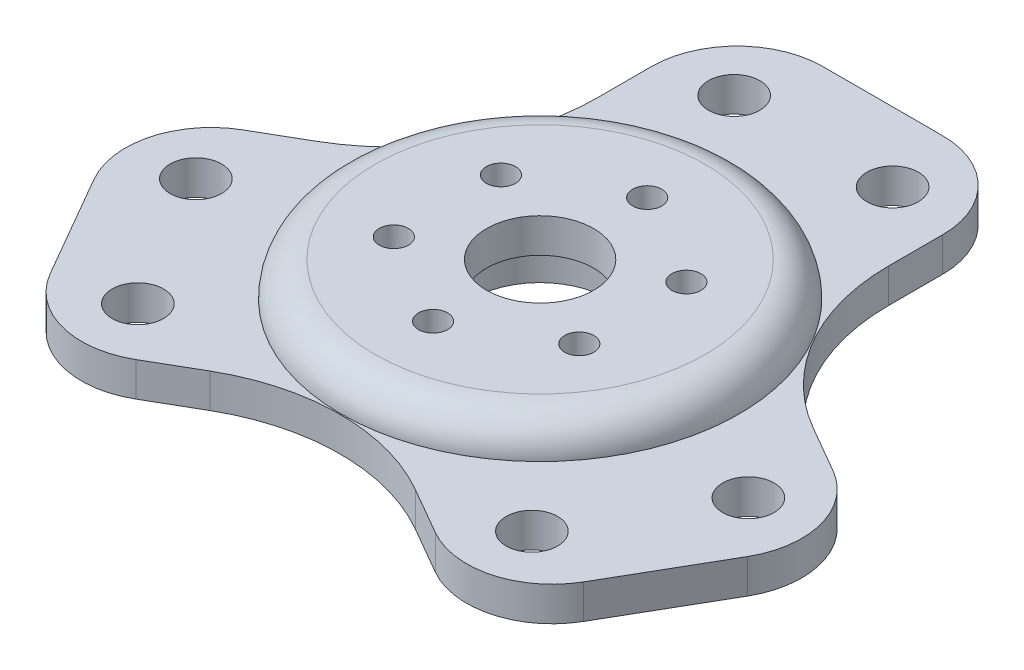
ISO-10303-21;
HEADER;
FILE_DESCRIPTION(('STEP AP214'),'2;1');
FILE_NAME('part.step','',(''),(''),'','','');
FILE_SCHEMA(('AUTOMOTIVE_DESIGN { 1 0 10303 214 1 1 1 1 }'));
ENDSEC;
DATA;
#1=APPLICATION_CONTEXT('core data for automotive mechanical design processes');
#2=APPLICATION_PROTOCOL_DEFINITION('international standard','automotive_design',2000,#1);
#3=PRODUCT_CONTEXT('',#1,'mechanical');
#4=PRODUCT('Part','Part','',(#3));
#5=PRODUCT_RELATED_PRODUCT_CATEGORY('part','',(#4));
#6=PRODUCT_DEFINITION_FORMATION('','',#4);
#7=PRODUCT_DEFINITION_CONTEXT('part definition',#1,'design');
#8=PRODUCT_DEFINITION('design','',#6,#7);
#9=PRODUCT_DEFINITION_SHAPE('','',#8);
#10=(LENGTH_UNIT() NAMED_UNIT(*) SI_UNIT(.MILLI.,.METRE.));
#11=(NAMED_UNIT(*) PLANE_ANGLE_UNIT() SI_UNIT($,.RADIAN.));
#12=(NAMED_UNIT(*) SI_UNIT($,.STERADIAN.) SOLID_ANGLE_UNIT());
#13=UNCERTAINTY_MEASURE_WITH_UNIT(LENGTH_MEASURE(1.E-05),#10,'distance_accuracy_value','');
#14=(GEOMETRIC_REPRESENTATION_CONTEXT(3) GLOBAL_UNCERTAINTY_ASSIGNED_CONTEXT((#13)) GLOBAL_UNIT_ASSIGNED_CONTEXT((#10,
#11,#12)) REPRESENTATION_CONTEXT('',''));
#15=CARTESIAN_POINT('',(0.,0.,0.));
#16=DIRECTION('',(0.,0.,1.));
#17=DIRECTION('',(1.,0.,0.));
#18=AXIS2_PLACEMENT_3D('',#15,#16,#17);
#19=CARTESIAN_POINT('',(0.,8.,0.));
#20=DIRECTION('',(0.,1.,0.));
#21=DIRECTION('',(0.,0.,1.));
#22=AXIS2_PLACEMENT_3D('',#19,#20,#21);
#23=PLANE('',#22);
#24=CARTESIAN_POINT('',(0.,8.,0.));
#25=DIRECTION('',(0.,1.,0.));
#26=DIRECTION('',(0.,0.,1.));
#27=AXIS2_PLACEMENT_3D('',#24,#25,#26);
#28=CIRCLE('',#27,19.25);
#29=CARTESIAN_POINT('',(0.,8.,19.25));
#30=VERTEX_POINT('',#29);
#31=EDGE_CURVE('E11',#30,#30,#28,.T.);
#32=ORIENTED_EDGE('',*,*,#31,.T.);
#33=EDGE_LOOP('',(#32));
#34=FACE_BOUND('',#33,.T.);
#35=CARTESIAN_POINT('',(0.,8.,0.));
#36=DIRECTION('',(0.,1.,0.));
#37=DIRECTION('',(0.,0.,1.));
#38=AXIS2_PLACEMENT_3D('',#35,#36,#37);
#39=CIRCLE('',#38,6.25);
#40=CARTESIAN_POINT('',(0.,8.,6.25));
#41=VERTEX_POINT('',#40);
#42=EDGE_CURVE('E226',#41,#41,#39,.T.);
#43=ORIENTED_EDGE('',*,*,#42,.F.);
#44=EDGE_LOOP('',(#43));
#45=FACE_BOUND('',#44,.T.);
#46=CARTESIAN_POINT('',(0.,8.,-12.5));
#47=DIRECTION('',(0.,1.,0.));
#48=DIRECTION('',(0.,0.,1.));
#49=AXIS2_PLACEMENT_3D('',#46,#47,#48);
#50=CIRCLE('',#49,1.7);
#51=CARTESIAN_POINT('',(0.,8.,-10.8));
#52=VERTEX_POINT('',#51);
#53=EDGE_CURVE('E256',#52,#52,#50,.T.);
#54=ORIENTED_EDGE('',*,*,#53,.F.);
#55=EDGE_LOOP('',(#54));
#56=FACE_BOUND('',#55,.T.);
#57=CARTESIAN_POINT('',(-10.8253175473055,8.,-6.24999999999998));
#58=DIRECTION('',(0.,1.,0.));
#59=DIRECTION('',(0.86602540378444,0.,0.499999999999998));
#60=AXIS2_PLACEMENT_3D('',#57,#58,#59);
#61=CIRCLE('',#60,1.7);
#62=CARTESIAN_POINT('',(-9.35307436087195,8.,-5.39999999999998));
#63=VERTEX_POINT('',#62);
#64=EDGE_CURVE('E262',#63,#63,#61,.T.);
#65=ORIENTED_EDGE('',*,*,#64,.F.);
#66=EDGE_LOOP('',(#65));
#67=FACE_BOUND('',#66,.T.);
#68=CARTESIAN_POINT('',(-10.8253175473055,8.,6.25000000000005));
#69=DIRECTION('',(0.,1.,0.));
#70=DIRECTION('',(0.866025403784436,0.,-0.500000000000004));
#71=AXIS2_PLACEMENT_3D('',#68,#69,#70);
#72=CIRCLE('',#71,1.7);
#73=CARTESIAN_POINT('',(-9.35307436087191,8.,5.40000000000004));
#74=VERTEX_POINT('',#73);
#75=EDGE_CURVE('E287',#74,#74,#72,.T.);
#76=ORIENTED_EDGE('',*,*,#75,.F.);
#77=EDGE_LOOP('',(#76));
#78=FACE_BOUND('',#77,.T.);
#79=CARTESIAN_POINT('',(0.,8.,12.5));
#80=DIRECTION('',(0.,1.,0.));
#81=DIRECTION('',(0.,0.,-1.));
#82=AXIS2_PLACEMENT_3D('',#79,#80,#81);
#83=CIRCLE('',#82,1.7);
#84=CARTESIAN_POINT('',(0.,8.,10.8));
#85=VERTEX_POINT('',#84);
#86=EDGE_CURVE('E281',#85,#85,#83,.T.);
#87=ORIENTED_EDGE('',*,*,#86,.F.);
#88=EDGE_LOOP('',(#87));
#89=FACE_BOUND('',#88,.T.);
#90=CARTESIAN_POINT('',(10.8253175473055,8.,6.2499999999999));
#91=DIRECTION('',(0.,1.,0.));
#92=DIRECTION('',(-0.866025403784443,0.,-0.499999999999992));
#93=AXIS2_PLACEMENT_3D('',#90,#91,#92);
#94=CIRCLE('',#93,1.7);
#95=CARTESIAN_POINT('',(9.35307436087199,8.,5.39999999999991));
#96=VERTEX_POINT('',#95);
#97=EDGE_CURVE('E275',#96,#96,#94,.T.);
#98=ORIENTED_EDGE('',*,*,#97,.F.);
#99=EDGE_LOOP('',(#98));
#100=FACE_BOUND('',#99,.T.);
#101=CARTESIAN_POINT('',(10.8253175473054,8.,-6.25000000000013));
#102=DIRECTION('',(0.,1.,0.));
#103=DIRECTION('',(-0.866025403784433,0.,0.50000000000001));
#104=AXIS2_PLACEMENT_3D('',#101,#102,#103);
#105=CIRCLE('',#104,1.7);
#106=CARTESIAN_POINT('',(9.35307436087188,8.,-5.40000000000011));
#107=VERTEX_POINT('',#106);
#108=EDGE_CURVE('E268',#107,#107,#105,.T.);
#109=ORIENTED_EDGE('',*,*,#108,.F.);
#110=EDGE_LOOP('',(#109));
#111=FACE_BOUND('',#110,.T.);
#112=ADVANCED_FACE('F37',(#34,#45,#56,#67,#78,#89,#100,#111),#23,.T.);
#113=CARTESIAN_POINT('',(0.,0.,0.));
#114=DIRECTION('',(0.,1.,0.));
#115=DIRECTION('',(0.,0.,1.));
#116=AXIS2_PLACEMENT_3D('',#113,#114,#115);
#117=PLANE('',#116);
#118=CARTESIAN_POINT('',(22.9998211249864,0.,23.9599328978324));
#119=DIRECTION('',(0.,1.,0.));
#120=DIRECTION('',(-0.866025403784436,0.,-0.500000000000004));
#121=AXIS2_PLACEMENT_3D('',#118,#119,#120);
#122=CIRCLE('',#121,3.);
#123=CARTESIAN_POINT('',(20.4017449136331,0.,22.4599328978324));
#124=VERTEX_POINT('',#123);
#125=EDGE_CURVE('E316',#124,#124,#122,.T.);
#126=ORIENTED_EDGE('',*,*,#125,.T.);
#127=EDGE_LOOP('',(#126));
#128=FACE_BOUND('',#127,.T.);
#129=CARTESIAN_POINT('',(-22.9998211249866,0.,23.9599328978322));
#130=DIRECTION('',(0.,1.,0.));
#131=DIRECTION('',(-0.866025403784436,0.,-0.500000000000004));
#132=AXIS2_PLACEMENT_3D('',#129,#130,#131);
#133=CIRCLE('',#132,3.);
#134=CARTESIAN_POINT('',(-25.5978973363399,0.,22.4599328978322));
#135=VERTEX_POINT('',#134);
#136=EDGE_CURVE('E339',#135,#135,#133,.T.);
#137=ORIENTED_EDGE('',*,*,#136,.T.);
#138=EDGE_LOOP('',(#137));
#139=FACE_BOUND('',#138,.T.);
#140=CARTESIAN_POINT('',(-32.2498211249866,0.,7.93846292781986));
#141=DIRECTION('',(0.,1.,0.));
#142=DIRECTION('',(0.866025403784443,0.,-0.499999999999992));
#143=AXIS2_PLACEMENT_3D('',#140,#141,#142);
#144=CIRCLE('',#143,3.);
#145=CARTESIAN_POINT('',(-29.6517449136332,0.,6.43846292781989));
#146=VERTEX_POINT('',#145);
#147=EDGE_CURVE('E333',#146,#146,#144,.T.);
#148=ORIENTED_EDGE('',*,*,#147,.T.);
#149=EDGE_LOOP('',(#148));
#150=FACE_BOUND('',#149,.T.);
#151=CARTESIAN_POINT('',(-9.2499999999997,0.,-31.8983958256525));
#152=DIRECTION('',(0.,1.,0.));
#153=DIRECTION('',(0.866025403784443,0.,-0.499999999999992));
#154=AXIS2_PLACEMENT_3D('',#151,#152,#153);
#155=CIRCLE('',#154,3.);
#156=CARTESIAN_POINT('',(-6.65192378864637,0.,-33.3983958256525));
#157=VERTEX_POINT('',#156);
#158=EDGE_CURVE('E327',#157,#157,#155,.T.);
#159=ORIENTED_EDGE('',*,*,#158,.T.);
#160=EDGE_LOOP('',(#159));
#161=FACE_BOUND('',#160,.T.);
#162=CARTESIAN_POINT('',(9.24999999999999,0.,-31.8983958256524));
#163=DIRECTION('',(0.,1.,0.));
#164=DIRECTION('',(0.,0.,1.));
#165=AXIS2_PLACEMENT_3D('',#162,#163,#164);
#166=CIRCLE('',#165,3.);
#167=CARTESIAN_POINT('',(9.24999999999999,0.,-28.8983958256524));
#168=VERTEX_POINT('',#167);
#169=EDGE_CURVE('E311',#168,#168,#166,.T.);
#170=ORIENTED_EDGE('',*,*,#169,.T.);
#171=EDGE_LOOP('',(#170));
#172=FACE_BOUND('',#171,.T.);
#173=CARTESIAN_POINT('',(32.2498211249865,0.,7.93846292782016));
#174=DIRECTION('',(0.,1.,0.));
#175=DIRECTION('',(0.,0.,1.));
#176=AXIS2_PLACEMENT_3D('',#173,#174,#175);
#177=CIRCLE('',#176,3.);
#178=CARTESIAN_POINT('',(32.2498211249865,0.,10.9384629278202));
#179=VERTEX_POINT('',#178);
#180=EDGE_CURVE('E315',#179,#179,#177,.T.);
#181=ORIENTED_EDGE('',*,*,#180,.T.);
#182=EDGE_LOOP('',(#181));
#183=FACE_BOUND('',#182,.T.);
#184=CARTESIAN_POINT('',(10.8253175473054,0.,-6.25000000000013));
#185=DIRECTION('',(0.,1.,0.));
#186=DIRECTION('',(-0.866025403784433,0.,0.50000000000001));
#187=AXIS2_PLACEMENT_3D('',#184,#185,#186);
#188=CIRCLE('',#187,1.7);
#189=CARTESIAN_POINT('',(9.35307436087188,0.,-5.40000000000011));
#190=VERTEX_POINT('',#189);
#191=EDGE_CURVE('E271',#190,#190,#188,.T.);
#192=ORIENTED_EDGE('',*,*,#191,.T.);
#193=EDGE_LOOP('',(#192));
#194=FACE_BOUND('',#193,.T.);
#195=CARTESIAN_POINT('',(10.8253175473055,0.,6.2499999999999));
#196=DIRECTION('',(0.,1.,0.));
#197=DIRECTION('',(-0.866025403784443,0.,-0.499999999999992));
#198=AXIS2_PLACEMENT_3D('',#195,#196,#197);
#199=CIRCLE('',#198,1.7);
#200=CARTESIAN_POINT('',(9.35307436087199,0.,5.39999999999991));
#201=VERTEX_POINT('',#200);
#202=EDGE_CURVE('E278',#201,#201,#199,.T.);
#203=ORIENTED_EDGE('',*,*,#202,.T.);
#204=EDGE_LOOP('',(#203));
#205=FACE_BOUND('',#204,.T.);
#206=CARTESIAN_POINT('',(0.,0.,12.5));
#207=DIRECTION('',(0.,1.,0.));
#208=DIRECTION('',(0.,0.,-1.));
#209=AXIS2_PLACEMENT_3D('',#206,#207,#208);
#210=CIRCLE('',#209,1.7);
#211=CARTESIAN_POINT('',(0.,0.,10.8));
#212=VERTEX_POINT('',#211);
#213=EDGE_CURVE('E284',#212,#212,#210,.T.);
#214=ORIENTED_EDGE('',*,*,#213,.T.);
#215=EDGE_LOOP('',(#214));
#216=FACE_BOUND('',#215,.T.);
#217=CARTESIAN_POINT('',(-10.8253175473055,0.,6.25000000000005));
#218=DIRECTION('',(0.,1.,0.));
#219=DIRECTION('',(0.866025403784436,0.,-0.500000000000004));
#220=AXIS2_PLACEMENT_3D('',#217,#218,#219);
#221=CIRCLE('',#220,1.7);
#222=CARTESIAN_POINT('',(-9.35307436087191,0.,5.40000000000004));
#223=VERTEX_POINT('',#222);
#224=EDGE_CURVE('E265',#223,#223,#221,.T.);
#225=ORIENTED_EDGE('',*,*,#224,.T.);
#226=EDGE_LOOP('',(#225));
#227=FACE_BOUND('',#226,.T.);
#228=CARTESIAN_POINT('',(-10.8253175473055,0.,-6.24999999999998));
#229=DIRECTION('',(0.,1.,0.));
#230=DIRECTION('',(0.86602540378444,0.,0.499999999999998));
#231=AXIS2_PLACEMENT_3D('',#228,#229,#230);
#232=CIRCLE('',#231,1.7);
#233=CARTESIAN_POINT('',(-9.35307436087195,0.,-5.39999999999998));
#234=VERTEX_POINT('',#233);
#235=EDGE_CURVE('E259',#234,#234,#232,.T.);
#236=ORIENTED_EDGE('',*,*,#235,.T.);
#237=EDGE_LOOP('',(#236));
#238=FACE_BOUND('',#237,.T.);
#239=CARTESIAN_POINT('',(0.,0.,-12.5));
#240=DIRECTION('',(0.,1.,0.));
#241=DIRECTION('',(0.,0.,1.));
#242=AXIS2_PLACEMENT_3D('',#239,#240,#241);
#243=CIRCLE('',#242,1.7);
#244=CARTESIAN_POINT('',(0.,0.,-10.8));
#245=VERTEX_POINT('',#244);
#246=EDGE_CURVE('E253',#245,#245,#243,.T.);
#247=ORIENTED_EDGE('',*,*,#246,.T.);
#248=EDGE_LOOP('',(#247));
#249=FACE_BOUND('',#248,.T.);
#250=CARTESIAN_POINT('',(0.,0.,0.));
#251=DIRECTION('',(0.,1.,0.));
#252=DIRECTION('',(0.,0.,1.));
#253=AXIS2_PLACEMENT_3D('',#250,#251,#252);
#254=CIRCLE('',#253,8.);
#255=CARTESIAN_POINT('',(0.,0.,8.));
#256=VERTEX_POINT('',#255);
#257=EDGE_CURVE('E250',#256,#256,#254,.T.);
#258=ORIENTED_EDGE('',*,*,#257,.T.);
#259=EDGE_LOOP('',(#258));
#260=FACE_BOUND('',#259,.T.);
#261=DIRECTION('',(0.,0.,1.));
#262=VECTOR('',#261,1.);
#263=CARTESIAN_POINT('',(-17.,0.,-9.81495457622364));
#264=LINE('',#263,#262);
#265=CARTESIAN_POINT('',(-17.,0.,-30.));
#266=VERTEX_POINT('',#265);
#267=CARTESIAN_POINT('',(-17.,0.,-23.6713610367747));
#268=VERTEX_POINT('',#267);
#269=EDGE_CURVE('E137',#266,#268,#264,.T.);
#270=ORIENTED_EDGE('',*,*,#269,.F.);
#271=CARTESIAN_POINT('',(-7.,0.,-30.));
#272=DIRECTION('',(0.,1.,0.));
#273=DIRECTION('',(0.,0.,1.));
#274=AXIS2_PLACEMENT_3D('',#271,#272,#273);
#275=CIRCLE('',#274,10.);
#276=CARTESIAN_POINT('',(-7.,0.,-40.));
#277=VERTEX_POINT('',#276);
#278=EDGE_CURVE('E206',#266,#277,#275,.F.);
#279=ORIENTED_EDGE('',*,*,#278,.T.);
#280=DIRECTION('',(-1.,0.,0.));
#281=VECTOR('',#280,1.);
#282=CARTESIAN_POINT('',(-17.,0.,-40.));
#283=LINE('',#282,#281);
#284=CARTESIAN_POINT('',(7.,0.,-40.));
#285=VERTEX_POINT('',#284);
#286=EDGE_CURVE('E149',#285,#277,#283,.T.);
#287=ORIENTED_EDGE('',*,*,#286,.F.);
#288=CARTESIAN_POINT('',(7.,0.,-30.));
#289=DIRECTION('',(0.,1.,0.));
#290=DIRECTION('',(0.,0.,1.));
#291=AXIS2_PLACEMENT_3D('',#288,#289,#290);
#292=CIRCLE('',#291,10.);
#293=CARTESIAN_POINT('',(17.,0.,-30.));
#294=VERTEX_POINT('',#293);
#295=EDGE_CURVE('E208',#285,#294,#292,.F.);
#296=ORIENTED_EDGE('',*,*,#295,.T.);
#297=DIRECTION('',(0.,0.,-1.));
#298=VECTOR('',#297,1.);
#299=CARTESIAN_POINT('',(17.,0.,-40.));
#300=LINE('',#299,#298);
#301=CARTESIAN_POINT('',(17.,0.,-23.6713610367747));
#302=VERTEX_POINT('',#301);
#303=EDGE_CURVE('E231',#302,#294,#300,.T.);
#304=ORIENTED_EDGE('',*,*,#303,.F.);
#305=CARTESIAN_POINT('',(41.,0.,-23.6713610367747));
#306=DIRECTION('',(0.,1.,0.));
#307=DIRECTION('',(0.,0.,1.));
#308=AXIS2_PLACEMENT_3D('',#305,#306,#307);
#309=CIRCLE('',#308,24.);
#310=CARTESIAN_POINT('',(29.,0.,-2.88675134594813));
#311=VERTEX_POINT('',#310);
#312=EDGE_CURVE('E118',#302,#311,#309,.T.);
#313=ORIENTED_EDGE('',*,*,#312,.T.);
#314=DIRECTION('',(-0.866025403784439,0.,-0.5));
#315=VECTOR('',#314,1.);
#316=CARTESIAN_POINT('',(17.,0.,-9.81495457622364));
#317=LINE('',#316,#315);
#318=CARTESIAN_POINT('',(34.4807621135332,0.,0.27756813566455));
#319=VERTEX_POINT('',#318);
#320=EDGE_CURVE('E234',#319,#311,#317,.T.);
#321=ORIENTED_EDGE('',*,*,#320,.F.);
#322=CARTESIAN_POINT('',(29.4807621135332,0.,8.93782217350893));
#323=DIRECTION('',(0.,1.,0.));
#324=DIRECTION('',(0.,0.,1.));
#325=AXIS2_PLACEMENT_3D('',#322,#323,#324);
#326=CIRCLE('',#325,10.);
#327=CARTESIAN_POINT('',(38.1410161513776,0.,13.9378221735089));
#328=VERTEX_POINT('',#327);
#329=EDGE_CURVE('E211',#319,#328,#326,.F.);
#330=ORIENTED_EDGE('',*,*,#329,.T.);
#331=DIRECTION('',(0.5,0.,-0.866025403784439));
#332=VECTOR('',#331,1.);
#333=CARTESIAN_POINT('',(43.1410161513776,0.,5.27756813566454));
#334=LINE('',#333,#332);
#335=CARTESIAN_POINT('',(31.1410161513775,0.,26.0621778264911));
#336=VERTEX_POINT('',#335);
#337=EDGE_CURVE('E237',#336,#328,#334,.T.);
#338=ORIENTED_EDGE('',*,*,#337,.F.);
#339=CARTESIAN_POINT('',(22.4807621135332,0.,21.0621778264911));
#340=DIRECTION('',(0.,1.,0.));
#341=DIRECTION('',(0.,0.,1.));
#342=AXIS2_PLACEMENT_3D('',#339,#340,#341);
#343=CIRCLE('',#342,10.);
#344=CARTESIAN_POINT('',(17.4807621135332,0.,29.7224318643355));
#345=VERTEX_POINT('',#344);
#346=EDGE_CURVE('E214',#336,#345,#343,.F.);
#347=ORIENTED_EDGE('',*,*,#346,.T.);
#348=DIRECTION('',(0.866025403784439,0.,0.5));
#349=VECTOR('',#348,1.);
#350=CARTESIAN_POINT('',(26.1410161513776,0.,34.7224318643355));
#351=LINE('',#350,#349);
#352=CARTESIAN_POINT('',(12.,0.,26.5581123827228));
#353=VERTEX_POINT('',#352);
#354=EDGE_CURVE('E240',#353,#345,#351,.T.);
#355=ORIENTED_EDGE('',*,*,#354,.F.);
#356=CARTESIAN_POINT('',(0.,0.,47.3427220735493));
#357=DIRECTION('',(0.,1.,0.));
#358=DIRECTION('',(0.,0.,1.));
#359=AXIS2_PLACEMENT_3D('',#356,#357,#358);
#360=CIRCLE('',#359,24.);
#361=CARTESIAN_POINT('',(-12.,0.,26.5581123827228));
#362=VERTEX_POINT('',#361);
#363=EDGE_CURVE('E53',#353,#362,#360,.T.);
#364=ORIENTED_EDGE('',*,*,#363,.T.);
#365=DIRECTION('',(0.866025403784439,0.,-0.5));
#366=VECTOR('',#365,1.);
#367=CARTESIAN_POINT('',(0.,0.,19.6299091524473));
#368=LINE('',#367,#366);
#369=CARTESIAN_POINT('',(-17.4807621135332,0.,29.7224318643355));
#370=VERTEX_POINT('',#369);
#371=EDGE_CURVE('E242',#370,#362,#368,.T.);
#372=ORIENTED_EDGE('',*,*,#371,.F.);
#373=CARTESIAN_POINT('',(-22.4807621135332,0.,21.0621778264911));
#374=DIRECTION('',(0.,1.,0.));
#375=DIRECTION('',(0.,0.,1.));
#376=AXIS2_PLACEMENT_3D('',#373,#374,#375);
#377=CIRCLE('',#376,10.);
#378=CARTESIAN_POINT('',(-31.1410161513776,0.,26.0621778264911));
#379=VERTEX_POINT('',#378);
#380=EDGE_CURVE('E219',#370,#379,#377,.F.);
#381=ORIENTED_EDGE('',*,*,#380,.T.);
#382=DIRECTION('',(0.5,0.,0.866025403784439));
#383=VECTOR('',#382,1.);
#384=CARTESIAN_POINT('',(-26.1410161513776,0.,34.7224318643355));
#385=LINE('',#384,#383);
#386=CARTESIAN_POINT('',(-38.1410161513776,0.,13.9378221735089));
#387=VERTEX_POINT('',#386);
#388=EDGE_CURVE('E244',#387,#379,#385,.T.);
#389=ORIENTED_EDGE('',*,*,#388,.F.);
#390=CARTESIAN_POINT('',(-29.4807621135332,0.,8.93782217350893));
#391=DIRECTION('',(0.,1.,0.));
#392=DIRECTION('',(0.,0.,1.));
#393=AXIS2_PLACEMENT_3D('',#390,#391,#392);
#394=CIRCLE('',#393,10.);
#395=CARTESIAN_POINT('',(-34.4807621135332,0.,0.27756813566455));
#396=VERTEX_POINT('',#395);
#397=EDGE_CURVE('E217',#387,#396,#394,.F.);
#398=ORIENTED_EDGE('',*,*,#397,.T.);
#399=DIRECTION('',(-0.866025403784439,0.,0.5));
#400=VECTOR('',#399,1.);
#401=CARTESIAN_POINT('',(-43.1410161513776,0.,5.27756813566455));
#402=LINE('',#401,#400);
#403=CARTESIAN_POINT('',(-29.,0.,-2.88675134594813));
#404=VERTEX_POINT('',#403);
#405=EDGE_CURVE('E140',#404,#396,#402,.T.);
#406=ORIENTED_EDGE('',*,*,#405,.F.);
#407=CARTESIAN_POINT('',(-41.,0.,-23.6713610367747));
#408=DIRECTION('',(0.,1.,0.));
#409=DIRECTION('',(0.,0.,1.));
#410=AXIS2_PLACEMENT_3D('',#407,#408,#409);
#411=CIRCLE('',#410,24.);
#412=EDGE_CURVE('E129',#404,#268,#411,.T.);
#413=ORIENTED_EDGE('',*,*,#412,.T.);
#414=EDGE_LOOP('',(#270,#279,#287,#296,#304,#313,#321,#330,#338,#347,#355,#364,#372,#381,#389,
#398,#406,#413));
#415=FACE_BOUND('',#414,.T.);
#416=ADVANCED_FACE('F134',(#128,#139,#150,#161,#172,#183,#194,#205,#216,#227,#238,#249,#260,
#415),#117,.F.);
#417=CARTESIAN_POINT('',(-43.1410161513776,8.,5.27756813566455));
#418=DIRECTION('',(0.5,0.,0.866025403784439));
#419=DIRECTION('',(0.866025403784439,0.,-0.5));
#420=AXIS2_PLACEMENT_3D('',#417,#418,#419);
#421=PLANE('',#420);
#422=DIRECTION('',(0.866025403784439,0.,-0.5));
#423=VECTOR('',#422,1.);
#424=CARTESIAN_POINT('',(-43.1410161513776,4.,5.27756813566455));
#425=LINE('',#424,#423);
#426=CARTESIAN_POINT('',(-34.4807621135332,4.,0.27756813566455));
#427=VERTEX_POINT('',#426);
#428=CARTESIAN_POINT('',(-29.,4.,-2.88675134594813));
#429=VERTEX_POINT('',#428);
#430=EDGE_CURVE('E272',#427,#429,#425,.T.);
#431=ORIENTED_EDGE('',*,*,#430,.T.);
#432=DIRECTION('',(0.,-1.,0.));
#433=VECTOR('',#432,1.);
#434=CARTESIAN_POINT('',(-29.,0.,-2.88675134594813));
#435=LINE('',#434,#433);
#436=EDGE_CURVE('E120',#429,#404,#435,.T.);
#437=ORIENTED_EDGE('',*,*,#436,.T.);
#438=ORIENTED_EDGE('',*,*,#405,.T.);
#439=DIRECTION('',(0.,-1.,0.));
#440=VECTOR('',#439,1.);
#441=CARTESIAN_POINT('',(-34.4807621135332,8.,0.27756813566455));
#442=LINE('',#441,#440);
#443=EDGE_CURVE('E167',#396,#427,#442,.F.);
#444=ORIENTED_EDGE('',*,*,#443,.T.);
#445=EDGE_LOOP('',(#431,#437,#438,#444));
#446=FACE_BOUND('',#445,.T.);
#447=ADVANCED_FACE('F391',(#446),#421,.F.);
#448=CARTESIAN_POINT('',(-26.1410161513776,8.,34.7224318643355));
#449=DIRECTION('',(0.866025403784439,0.,-0.5));
#450=DIRECTION('',(-0.5,0.,-0.866025403784439));
#451=AXIS2_PLACEMENT_3D('',#448,#449,#450);
#452=PLANE('',#451);
#453=DIRECTION('',(-0.5,0.,-0.866025403784439));
#454=VECTOR('',#453,1.);
#455=CARTESIAN_POINT('',(-26.1410161513776,4.,34.7224318643355));
#456=LINE('',#455,#454);
#457=CARTESIAN_POINT('',(-31.1410161513776,4.,26.0621778264911));
#458=VERTEX_POINT('',#457);
#459=CARTESIAN_POINT('',(-38.1410161513776,4.,13.9378221735089));
#460=VERTEX_POINT('',#459);
#461=EDGE_CURVE('E293',#458,#460,#456,.T.);
#462=ORIENTED_EDGE('',*,*,#461,.T.);
#463=DIRECTION('',(0.,-1.,0.));
#464=VECTOR('',#463,1.);
#465=CARTESIAN_POINT('',(-38.1410161513776,8.,13.9378221735089));
#466=LINE('',#465,#464);
#467=EDGE_CURVE('E170',#460,#387,#466,.T.);
#468=ORIENTED_EDGE('',*,*,#467,.T.);
#469=ORIENTED_EDGE('',*,*,#388,.T.);
#470=DIRECTION('',(0.,-1.,0.));
#471=VECTOR('',#470,1.);
#472=CARTESIAN_POINT('',(-31.1410161513776,8.,26.0621778264911));
#473=LINE('',#472,#471);
#474=EDGE_CURVE('E173',#379,#458,#473,.F.);
#475=ORIENTED_EDGE('',*,*,#474,.T.);
#476=EDGE_LOOP('',(#462,#468,#469,#475));
#477=FACE_BOUND('',#476,.T.);
#478=ADVANCED_FACE('F421',(#477),#452,.F.);
#479=CARTESIAN_POINT('',(0.,8.,19.6299091524473));
#480=DIRECTION('',(-0.5,0.,-0.866025403784439));
#481=DIRECTION('',(-0.866025403784439,0.,0.5));
#482=AXIS2_PLACEMENT_3D('',#479,#480,#481);
#483=PLANE('',#482);
#484=ORIENTED_EDGE('',*,*,#371,.T.);
#485=DIRECTION('',(0.,-1.,0.));
#486=VECTOR('',#485,1.);
#487=CARTESIAN_POINT('',(-12.,8.,26.5581123827228));
#488=LINE('',#487,#486);
#489=CARTESIAN_POINT('',(-12.,4.,26.5581123827228));
#490=VERTEX_POINT('',#489);
#491=EDGE_CURVE('E116',#362,#490,#488,.F.);
#492=ORIENTED_EDGE('',*,*,#491,.T.);
#493=DIRECTION('',(-0.866025403784439,0.,0.5));
#494=VECTOR('',#493,1.);
#495=CARTESIAN_POINT('',(0.,4.,19.6299091524473));
#496=LINE('',#495,#494);
#497=CARTESIAN_POINT('',(-17.4807621135332,4.,29.7224318643355));
#498=VERTEX_POINT('',#497);
#499=EDGE_CURVE('E105',#490,#498,#496,.T.);
#500=ORIENTED_EDGE('',*,*,#499,.T.);
#501=DIRECTION('',(0.,-1.,0.));
#502=VECTOR('',#501,1.);
#503=CARTESIAN_POINT('',(-17.4807621135332,8.,29.7224318643355));
#504=LINE('',#503,#502);
#505=EDGE_CURVE('E159',#498,#370,#504,.T.);
#506=ORIENTED_EDGE('',*,*,#505,.T.);
#507=EDGE_LOOP('',(#484,#492,#500,#506));
#508=FACE_BOUND('',#507,.T.);
#509=ADVANCED_FACE('F418',(#508),#483,.F.);
#510=CARTESIAN_POINT('',(26.1410161513776,8.,34.7224318643355));
#511=DIRECTION('',(0.5,0.,-0.866025403784439));
#512=DIRECTION('',(-0.866025403784439,0.,-0.5));
#513=AXIS2_PLACEMENT_3D('',#510,#511,#512);
#514=PLANE('',#513);
#515=DIRECTION('',(-0.866025403784439,0.,-0.5));
#516=VECTOR('',#515,1.);
#517=CARTESIAN_POINT('',(26.1410161513776,4.,34.7224318643355));
#518=LINE('',#517,#516);
#519=CARTESIAN_POINT('',(17.4807621135332,4.,29.7224318643355));
#520=VERTEX_POINT('',#519);
#521=CARTESIAN_POINT('',(12.,4.,26.5581123827228));
#522=VERTEX_POINT('',#521);
#523=EDGE_CURVE('E101',#520,#522,#518,.T.);
#524=ORIENTED_EDGE('',*,*,#523,.T.);
#525=DIRECTION('',(0.,-1.,0.));
#526=VECTOR('',#525,1.);
#527=CARTESIAN_POINT('',(12.,0.,26.5581123827228));
#528=LINE('',#527,#526);
#529=EDGE_CURVE('E110',#522,#353,#528,.T.);
#530=ORIENTED_EDGE('',*,*,#529,.T.);
#531=ORIENTED_EDGE('',*,*,#354,.T.);
#532=DIRECTION('',(0.,-1.,0.));
#533=VECTOR('',#532,1.);
#534=CARTESIAN_POINT('',(17.4807621135332,8.,29.7224318643355));
#535=LINE('',#534,#533);
#536=EDGE_CURVE('E112',#345,#520,#535,.F.);
#537=ORIENTED_EDGE('',*,*,#536,.T.);
#538=EDGE_LOOP('',(#524,#530,#531,#537));
#539=FACE_BOUND('',#538,.T.);
#540=ADVANCED_FACE('F108',(#539),#514,.F.);
#541=CARTESIAN_POINT('',(43.1410161513776,8.,5.27756813566454));
#542=DIRECTION('',(-0.866025403784439,0.,-0.5));
#543=DIRECTION('',(-0.5,0.,0.866025403784439));
#544=AXIS2_PLACEMENT_3D('',#541,#542,#543);
#545=PLANE('',#544);
#546=ORIENTED_EDGE('',*,*,#337,.T.);
#547=DIRECTION('',(0.,-1.,0.));
#548=VECTOR('',#547,1.);
#549=CARTESIAN_POINT('',(38.1410161513776,8.,13.9378221735089));
#550=LINE('',#549,#548);
#551=CARTESIAN_POINT('',(38.1410161513776,4.,13.9378221735089));
#552=VERTEX_POINT('',#551);
#553=EDGE_CURVE('E182',#328,#552,#550,.F.);
#554=ORIENTED_EDGE('',*,*,#553,.T.);
#555=DIRECTION('',(-0.5,0.,0.866025403784439));
#556=VECTOR('',#555,1.);
#557=CARTESIAN_POINT('',(43.1410161513776,4.,5.27756813566454));
#558=LINE('',#557,#556);
#559=CARTESIAN_POINT('',(31.1410161513776,4.,26.0621778264911));
#560=VERTEX_POINT('',#559);
#561=EDGE_CURVE('E113',#552,#560,#558,.T.);
#562=ORIENTED_EDGE('',*,*,#561,.T.);
#563=DIRECTION('',(0.,-1.,0.));
#564=VECTOR('',#563,1.);
#565=CARTESIAN_POINT('',(31.1410161513776,8.,26.0621778264911));
#566=LINE('',#565,#564);
#567=EDGE_CURVE('E185',#560,#336,#566,.T.);
#568=ORIENTED_EDGE('',*,*,#567,.T.);
#569=EDGE_LOOP('',(#546,#554,#562,#568));
#570=FACE_BOUND('',#569,.T.);
#571=ADVANCED_FACE('F411',(#570),#545,.F.);
#572=CARTESIAN_POINT('',(17.,8.,-9.81495457622364));
#573=DIRECTION('',(-0.5,0.,0.866025403784439));
#574=DIRECTION('',(0.866025403784439,0.,0.5));
#575=AXIS2_PLACEMENT_3D('',#572,#573,#574);
#576=PLANE('',#575);
#577=ORIENTED_EDGE('',*,*,#320,.T.);
#578=DIRECTION('',(0.,-1.,0.));
#579=VECTOR('',#578,1.);
#580=CARTESIAN_POINT('',(29.,8.,-2.88675134594813));
#581=LINE('',#580,#579);
#582=CARTESIAN_POINT('',(29.,4.,-2.88675134594813));
#583=VERTEX_POINT('',#582);
#584=EDGE_CURVE('E153',#311,#583,#581,.F.);
#585=ORIENTED_EDGE('',*,*,#584,.T.);
#586=DIRECTION('',(0.866025403784439,0.,0.5));
#587=VECTOR('',#586,1.);
#588=CARTESIAN_POINT('',(17.,4.,-9.81495457622364));
#589=LINE('',#588,#587);
#590=CARTESIAN_POINT('',(34.4807621135332,4.,0.277568135664546));
#591=VERTEX_POINT('',#590);
#592=EDGE_CURVE('E299',#583,#591,#589,.T.);
#593=ORIENTED_EDGE('',*,*,#592,.T.);
#594=DIRECTION('',(0.,-1.,0.));
#595=VECTOR('',#594,1.);
#596=CARTESIAN_POINT('',(34.4807621135332,8.,0.277568135664546));
#597=LINE('',#596,#595);
#598=EDGE_CURVE('E188',#591,#319,#597,.T.);
#599=ORIENTED_EDGE('',*,*,#598,.T.);
#600=EDGE_LOOP('',(#577,#585,#593,#599));
#601=FACE_BOUND('',#600,.T.);
#602=ADVANCED_FACE('F407',(#601),#576,.F.);
#603=CARTESIAN_POINT('',(17.,8.,-40.));
#604=DIRECTION('',(-1.,0.,0.));
#605=DIRECTION('',(0.,0.,1.));
#606=AXIS2_PLACEMENT_3D('',#603,#604,#605);
#607=PLANE('',#606);
#608=DIRECTION('',(0.,0.,1.));
#609=VECTOR('',#608,1.);
#610=CARTESIAN_POINT('',(17.,4.,-40.));
#611=LINE('',#610,#609);
#612=CARTESIAN_POINT('',(17.,4.,-30.));
#613=VERTEX_POINT('',#612);
#614=CARTESIAN_POINT('',(17.,4.,-23.6713610367747));
#615=VERTEX_POINT('',#614);
#616=EDGE_CURVE('E302',#613,#615,#611,.T.);
#617=ORIENTED_EDGE('',*,*,#616,.T.);
#618=DIRECTION('',(0.,-1.,0.));
#619=VECTOR('',#618,1.);
#620=CARTESIAN_POINT('',(17.,0.,-23.6713610367747));
#621=LINE('',#620,#619);
#622=EDGE_CURVE('E154',#615,#302,#621,.T.);
#623=ORIENTED_EDGE('',*,*,#622,.T.);
#624=ORIENTED_EDGE('',*,*,#303,.T.);
#625=DIRECTION('',(0.,-1.,0.));
#626=VECTOR('',#625,1.);
#627=CARTESIAN_POINT('',(17.,8.,-30.));
#628=LINE('',#627,#626);
#629=EDGE_CURVE('E191',#294,#613,#628,.F.);
#630=ORIENTED_EDGE('',*,*,#629,.T.);
#631=EDGE_LOOP('',(#617,#623,#624,#630));
#632=FACE_BOUND('',#631,.T.);
#633=ADVANCED_FACE('F403',(#632),#607,.F.);
#634=CARTESIAN_POINT('',(-17.,8.,-40.));
#635=DIRECTION('',(0.,0.,1.));
#636=DIRECTION('',(1.,0.,0.));
#637=AXIS2_PLACEMENT_3D('',#634,#635,#636);
#638=PLANE('',#637);
#639=ORIENTED_EDGE('',*,*,#286,.T.);
#640=DIRECTION('',(0.,-1.,0.));
#641=VECTOR('',#640,1.);
#642=CARTESIAN_POINT('',(-7.,8.,-40.));
#643=LINE('',#642,#641);
#644=CARTESIAN_POINT('',(-7.,4.,-40.));
#645=VERTEX_POINT('',#644);
#646=EDGE_CURVE('E200',#277,#645,#643,.F.);
#647=ORIENTED_EDGE('',*,*,#646,.T.);
#648=DIRECTION('',(1.,0.,0.));
#649=VECTOR('',#648,1.);
#650=CARTESIAN_POINT('',(-17.,4.,-40.));
#651=LINE('',#650,#649);
#652=CARTESIAN_POINT('',(7.,4.,-40.));
#653=VERTEX_POINT('',#652);
#654=EDGE_CURVE('E305',#645,#653,#651,.T.);
#655=ORIENTED_EDGE('',*,*,#654,.T.);
#656=DIRECTION('',(0.,-1.,0.));
#657=VECTOR('',#656,1.);
#658=CARTESIAN_POINT('',(7.,8.,-40.));
#659=LINE('',#658,#657);
#660=EDGE_CURVE('E203',#653,#285,#659,.T.);
#661=ORIENTED_EDGE('',*,*,#660,.T.);
#662=EDGE_LOOP('',(#639,#647,#655,#661));
#663=FACE_BOUND('',#662,.T.);
#664=ADVANCED_FACE('F400',(#663),#638,.F.);
#665=CARTESIAN_POINT('',(-17.,8.,-9.81495457622364));
#666=DIRECTION('',(1.,0.,0.));
#667=DIRECTION('',(0.,0.,-1.));
#668=AXIS2_PLACEMENT_3D('',#665,#666,#667);
#669=PLANE('',#668);
#670=ORIENTED_EDGE('',*,*,#269,.T.);
#671=DIRECTION('',(0.,-1.,0.));
#672=VECTOR('',#671,1.);
#673=CARTESIAN_POINT('',(-17.,8.,-23.6713610367747));
#674=LINE('',#673,#672);
#675=CARTESIAN_POINT('',(-17.,4.,-23.6713610367747));
#676=VERTEX_POINT('',#675);
#677=EDGE_CURVE('E72',#268,#676,#674,.F.);
#678=ORIENTED_EDGE('',*,*,#677,.T.);
#679=DIRECTION('',(0.,0.,-1.));
#680=VECTOR('',#679,1.);
#681=CARTESIAN_POINT('',(-17.,4.,-9.81495457622364));
#682=LINE('',#681,#680);
#683=CARTESIAN_POINT('',(-17.,4.,-30.));
#684=VERTEX_POINT('',#683);
#685=EDGE_CURVE('E148',#676,#684,#682,.T.);
#686=ORIENTED_EDGE('',*,*,#685,.T.);
#687=DIRECTION('',(0.,-1.,0.));
#688=VECTOR('',#687,1.);
#689=CARTESIAN_POINT('',(-17.,8.,-30.));
#690=LINE('',#689,#688);
#691=EDGE_CURVE('E147',#684,#266,#690,.T.);
#692=ORIENTED_EDGE('',*,*,#691,.T.);
#693=EDGE_LOOP('',(#670,#678,#686,#692));
#694=FACE_BOUND('',#693,.T.);
#695=ADVANCED_FACE('F145',(#694),#669,.F.);
#696=CARTESIAN_POINT('',(0.,8.,0.));
#697=DIRECTION('',(0.,-1.,0.));
#698=DIRECTION('',(0.,0.,-1.));
#699=AXIS2_PLACEMENT_3D('',#696,#697,#698);
#700=CYLINDRICAL_SURFACE('',#699,6.25);
#701=CARTESIAN_POINT('',(0.,4.,0.));
#702=DIRECTION('',(0.,1.,0.));
#703=DIRECTION('',(0.,0.,1.));
#704=AXIS2_PLACEMENT_3D('',#701,#702,#703);
#705=CIRCLE('',#704,6.25);
#706=CARTESIAN_POINT('',(0.,4.,6.25));
#707=VERTEX_POINT('',#706);
#708=EDGE_CURVE('E224',#707,#707,#705,.T.);
#709=ORIENTED_EDGE('',*,*,#708,.F.);
#710=EDGE_LOOP('',(#709));
#711=FACE_BOUND('',#710,.T.);
#712=ORIENTED_EDGE('',*,*,#42,.T.);
#713=EDGE_LOOP('',(#712));
#714=FACE_BOUND('',#713,.T.);
#715=ADVANCED_FACE('F395',(#711,#714),#700,.F.);
#716=CARTESIAN_POINT('',(0.,4.,0.));
#717=DIRECTION('',(0.,-1.,0.));
#718=DIRECTION('',(0.,0.,-1.));
#719=AXIS2_PLACEMENT_3D('',#716,#717,#718);
#720=CYLINDRICAL_SURFACE('',#719,8.);
#721=CARTESIAN_POINT('',(0.,4.,0.));
#722=DIRECTION('',(0.,1.,0.));
#723=DIRECTION('',(0.,0.,1.));
#724=AXIS2_PLACEMENT_3D('',#721,#722,#723);
#725=CIRCLE('',#724,8.);
#726=CARTESIAN_POINT('',(0.,4.,8.));
#727=VERTEX_POINT('',#726);
#728=EDGE_CURVE('E227',#727,#727,#725,.T.);
#729=ORIENTED_EDGE('',*,*,#728,.T.);
#730=EDGE_LOOP('',(#729));
#731=FACE_BOUND('',#730,.T.);
#732=ORIENTED_EDGE('',*,*,#257,.F.);
#733=EDGE_LOOP('',(#732));
#734=FACE_BOUND('',#733,.T.);
#735=ADVANCED_FACE('F638',(#731,#734),#720,.F.);
#736=CARTESIAN_POINT('',(0.,4.,0.));
#737=DIRECTION('',(0.,1.,0.));
#738=DIRECTION('',(0.,0.,1.));
#739=AXIS2_PLACEMENT_3D('',#736,#737,#738);
#740=PLANE('',#739);
#741=ORIENTED_EDGE('',*,*,#708,.T.);
#742=EDGE_LOOP('',(#741));
#743=FACE_BOUND('',#742,.T.);
#744=ORIENTED_EDGE('',*,*,#728,.F.);
#745=EDGE_LOOP('',(#744));
#746=FACE_BOUND('',#745,.T.);
#747=ADVANCED_FACE('F629',(#743,#746),#740,.F.);
#748=CARTESIAN_POINT('',(0.,0.,-12.5));
#749=DIRECTION('',(0.,1.,0.));
#750=DIRECTION('',(0.,0.,1.));
#751=AXIS2_PLACEMENT_3D('',#748,#749,#750);
#752=CYLINDRICAL_SURFACE('',#751,1.7);
#753=ORIENTED_EDGE('',*,*,#246,.F.);
#754=EDGE_LOOP('',(#753));
#755=FACE_BOUND('',#754,.T.);
#756=ORIENTED_EDGE('',*,*,#53,.T.);
#757=EDGE_LOOP('',(#756));
#758=FACE_BOUND('',#757,.T.);
#759=ADVANCED_FACE('F559',(#755,#758),#752,.F.);
#760=CARTESIAN_POINT('',(-10.8253175473055,0.,-6.24999999999998));
#761=DIRECTION('',(0.,1.,0.));
#762=DIRECTION('',(0.,0.,1.));
#763=AXIS2_PLACEMENT_3D('',#760,#761,#762);
#764=CYLINDRICAL_SURFACE('',#763,1.7);
#765=ORIENTED_EDGE('',*,*,#235,.F.);
#766=EDGE_LOOP('',(#765));
#767=FACE_BOUND('',#766,.T.);
#768=ORIENTED_EDGE('',*,*,#64,.T.);
#769=EDGE_LOOP('',(#768));
#770=FACE_BOUND('',#769,.T.);
#771=ADVANCED_FACE('F553',(#767,#770),#764,.F.);
#772=CARTESIAN_POINT('',(-10.8253175473055,0.,6.25000000000005));
#773=DIRECTION('',(0.,1.,0.));
#774=DIRECTION('',(0.,0.,1.));
#775=AXIS2_PLACEMENT_3D('',#772,#773,#774);
#776=CYLINDRICAL_SURFACE('',#775,1.7);
#777=ORIENTED_EDGE('',*,*,#224,.F.);
#778=EDGE_LOOP('',(#777));
#779=FACE_BOUND('',#778,.T.);
#780=ORIENTED_EDGE('',*,*,#75,.T.);
#781=EDGE_LOOP('',(#780));
#782=FACE_BOUND('',#781,.T.);
#783=ADVANCED_FACE('F558',(#779,#782),#776,.F.);
#784=CARTESIAN_POINT('',(0.,0.,12.5));
#785=DIRECTION('',(0.,1.,0.));
#786=DIRECTION('',(0.,0.,1.));
#787=AXIS2_PLACEMENT_3D('',#784,#785,#786);
#788=CYLINDRICAL_SURFACE('',#787,1.7);
#789=ORIENTED_EDGE('',*,*,#213,.F.);
#790=EDGE_LOOP('',(#789));
#791=FACE_BOUND('',#790,.T.);
#792=ORIENTED_EDGE('',*,*,#86,.T.);
#793=EDGE_LOOP('',(#792));
#794=FACE_BOUND('',#793,.T.);
#795=ADVANCED_FACE('F569',(#791,#794),#788,.F.);
#796=CARTESIAN_POINT('',(10.8253175473055,0.,6.2499999999999));
#797=DIRECTION('',(0.,1.,0.));
#798=DIRECTION('',(0.,0.,1.));
#799=AXIS2_PLACEMENT_3D('',#796,#797,#798);
#800=CYLINDRICAL_SURFACE('',#799,1.7);
#801=ORIENTED_EDGE('',*,*,#202,.F.);
#802=EDGE_LOOP('',(#801));
#803=FACE_BOUND('',#802,.T.);
#804=ORIENTED_EDGE('',*,*,#97,.T.);
#805=EDGE_LOOP('',(#804));
#806=FACE_BOUND('',#805,.T.);
#807=ADVANCED_FACE('F574',(#803,#806),#800,.F.);
#808=CARTESIAN_POINT('',(10.8253175473054,0.,-6.25000000000013));
#809=DIRECTION('',(0.,1.,0.));
#810=DIRECTION('',(0.,0.,1.));
#811=AXIS2_PLACEMENT_3D('',#808,#809,#810);
#812=CYLINDRICAL_SURFACE('',#811,1.7);
#813=ORIENTED_EDGE('',*,*,#191,.F.);
#814=EDGE_LOOP('',(#813));
#815=FACE_BOUND('',#814,.T.);
#816=ORIENTED_EDGE('',*,*,#108,.T.);
#817=EDGE_LOOP('',(#816));
#818=FACE_BOUND('',#817,.T.);
#819=ADVANCED_FACE('F360',(#815,#818),#812,.F.);
#820=CARTESIAN_POINT('',(0.,4.,0.));
#821=DIRECTION('',(0.,-1.,0.));
#822=DIRECTION('',(0.,0.,-1.));
#823=AXIS2_PLACEMENT_3D('',#820,#821,#822);
#824=PLANE('',#823);
#825=CARTESIAN_POINT('',(22.9998211249864,4.,23.9599328978324));
#826=DIRECTION('',(0.,1.,0.));
#827=DIRECTION('',(-0.866025403784436,0.,-0.500000000000004));
#828=AXIS2_PLACEMENT_3D('',#825,#826,#827);
#829=CIRCLE('',#828,3.);
#830=CARTESIAN_POINT('',(20.4017449136331,4.,22.4599328978324));
#831=VERTEX_POINT('',#830);
#832=EDGE_CURVE('E342',#831,#831,#829,.T.);
#833=ORIENTED_EDGE('',*,*,#832,.F.);
#834=EDGE_LOOP('',(#833));
#835=FACE_BOUND('',#834,.T.);
#836=CARTESIAN_POINT('',(-22.9998211249866,4.,23.9599328978322));
#837=DIRECTION('',(0.,1.,0.));
#838=DIRECTION('',(-0.866025403784436,0.,-0.500000000000004));
#839=AXIS2_PLACEMENT_3D('',#836,#837,#838);
#840=CIRCLE('',#839,3.);
#841=CARTESIAN_POINT('',(-25.5978973363399,4.,22.4599328978322));
#842=VERTEX_POINT('',#841);
#843=EDGE_CURVE('E336',#842,#842,#840,.T.);
#844=ORIENTED_EDGE('',*,*,#843,.F.);
#845=EDGE_LOOP('',(#844));
#846=FACE_BOUND('',#845,.T.);
#847=CARTESIAN_POINT('',(-32.2498211249866,4.,7.93846292781986));
#848=DIRECTION('',(0.,1.,0.));
#849=DIRECTION('',(0.866025403784443,0.,-0.499999999999992));
#850=AXIS2_PLACEMENT_3D('',#847,#848,#849);
#851=CIRCLE('',#850,3.);
#852=CARTESIAN_POINT('',(-29.6517449136332,4.,6.43846292781989));
#853=VERTEX_POINT('',#852);
#854=EDGE_CURVE('E330',#853,#853,#851,.T.);
#855=ORIENTED_EDGE('',*,*,#854,.F.);
#856=EDGE_LOOP('',(#855));
#857=FACE_BOUND('',#856,.T.);
#858=CARTESIAN_POINT('',(-9.2499999999997,4.,-31.8983958256525));
#859=DIRECTION('',(0.,1.,0.));
#860=DIRECTION('',(0.866025403784443,0.,-0.499999999999992));
#861=AXIS2_PLACEMENT_3D('',#858,#859,#860);
#862=CIRCLE('',#861,3.);
#863=CARTESIAN_POINT('',(-6.65192378864637,4.,-33.3983958256525));
#864=VERTEX_POINT('',#863);
#865=EDGE_CURVE('E324',#864,#864,#862,.T.);
#866=ORIENTED_EDGE('',*,*,#865,.F.);
#867=EDGE_LOOP('',(#866));
#868=FACE_BOUND('',#867,.T.);
#869=CARTESIAN_POINT('',(9.24999999999999,4.,-31.8983958256524));
#870=DIRECTION('',(0.,1.,0.));
#871=DIRECTION('',(0.,0.,1.));
#872=AXIS2_PLACEMENT_3D('',#869,#870,#871);
#873=CIRCLE('',#872,3.);
#874=CARTESIAN_POINT('',(9.24999999999999,4.,-28.8983958256524));
#875=VERTEX_POINT('',#874);
#876=EDGE_CURVE('E319',#875,#875,#873,.T.);
#877=ORIENTED_EDGE('',*,*,#876,.F.);
#878=EDGE_LOOP('',(#877));
#879=FACE_BOUND('',#878,.T.);
#880=CARTESIAN_POINT('',(32.2498211249865,4.,7.93846292782016));
#881=DIRECTION('',(0.,1.,0.));
#882=DIRECTION('',(0.,0.,1.));
#883=AXIS2_PLACEMENT_3D('',#880,#881,#882);
#884=CIRCLE('',#883,3.);
#885=CARTESIAN_POINT('',(32.2498211249865,4.,10.9384629278202));
#886=VERTEX_POINT('',#885);
#887=EDGE_CURVE('E312',#886,#886,#884,.T.);
#888=ORIENTED_EDGE('',*,*,#887,.F.);
#889=EDGE_LOOP('',(#888));
#890=FACE_BOUND('',#889,.T.);
#891=CARTESIAN_POINT('',(0.,4.,0.));
#892=DIRECTION('',(0.,-1.,0.));
#893=DIRECTION('',(0.,0.,-1.));
#894=AXIS2_PLACEMENT_3D('',#891,#892,#893);
#895=CIRCLE('',#894,23.25);
#896=CARTESIAN_POINT('',(0.,4.,-23.25));
#897=VERTEX_POINT('',#896);
#898=EDGE_CURVE('E308',#897,#897,#895,.T.);
#899=ORIENTED_EDGE('',*,*,#898,.T.);
#900=EDGE_LOOP('',(#899));
#901=FACE_BOUND('',#900,.T.);
#902=ORIENTED_EDGE('',*,*,#561,.F.);
#903=CARTESIAN_POINT('',(29.4807621135332,4.,8.93782217350893));
#904=DIRECTION('',(0.,-1.,0.));
#905=DIRECTION('',(0.,0.,-1.));
#906=AXIS2_PLACEMENT_3D('',#903,#904,#905);
#907=CIRCLE('',#906,10.);
#908=EDGE_CURVE('E177',#552,#591,#907,.F.);
#909=ORIENTED_EDGE('',*,*,#908,.T.);
#910=ORIENTED_EDGE('',*,*,#592,.F.);
#911=CARTESIAN_POINT('',(41.,4.,-23.6713610367747));
#912=DIRECTION('',(0.,-1.,0.));
#913=DIRECTION('',(0.,0.,-1.));
#914=AXIS2_PLACEMENT_3D('',#911,#912,#913);
#915=CIRCLE('',#914,24.);
#916=EDGE_CURVE('E126',#583,#615,#915,.T.);
#917=ORIENTED_EDGE('',*,*,#916,.T.);
#918=ORIENTED_EDGE('',*,*,#616,.F.);
#919=CARTESIAN_POINT('',(7.,4.,-30.));
#920=DIRECTION('',(0.,-1.,0.));
#921=DIRECTION('',(0.,0.,-1.));
#922=AXIS2_PLACEMENT_3D('',#919,#920,#921);
#923=CIRCLE('',#922,10.);
#924=EDGE_CURVE('E197',#613,#653,#923,.F.);
#925=ORIENTED_EDGE('',*,*,#924,.T.);
#926=ORIENTED_EDGE('',*,*,#654,.F.);
#927=CARTESIAN_POINT('',(-7.,4.,-30.));
#928=DIRECTION('',(0.,-1.,0.));
#929=DIRECTION('',(0.,0.,-1.));
#930=AXIS2_PLACEMENT_3D('',#927,#928,#929);
#931=CIRCLE('',#930,10.);
#932=EDGE_CURVE('E194',#645,#684,#931,.F.);
#933=ORIENTED_EDGE('',*,*,#932,.T.);
#934=ORIENTED_EDGE('',*,*,#685,.F.);
#935=CARTESIAN_POINT('',(-41.,4.,-23.6713610367747));
#936=DIRECTION('',(0.,-1.,0.));
#937=DIRECTION('',(0.,0.,-1.));
#938=AXIS2_PLACEMENT_3D('',#935,#936,#937);
#939=CIRCLE('',#938,24.);
#940=EDGE_CURVE('E83',#676,#429,#939,.T.);
#941=ORIENTED_EDGE('',*,*,#940,.T.);
#942=ORIENTED_EDGE('',*,*,#430,.F.);
#943=CARTESIAN_POINT('',(-29.4807621135332,4.,8.93782217350893));
#944=DIRECTION('',(0.,-1.,0.));
#945=DIRECTION('',(0.,0.,-1.));
#946=AXIS2_PLACEMENT_3D('',#943,#944,#945);
#947=CIRCLE('',#946,10.);
#948=EDGE_CURVE('E162',#427,#460,#947,.F.);
#949=ORIENTED_EDGE('',*,*,#948,.T.);
#950=ORIENTED_EDGE('',*,*,#461,.F.);
#951=CARTESIAN_POINT('',(-22.4807621135332,4.,21.0621778264911));
#952=DIRECTION('',(0.,-1.,0.));
#953=DIRECTION('',(0.,0.,-1.));
#954=AXIS2_PLACEMENT_3D('',#951,#952,#953);
#955=CIRCLE('',#954,10.);
#956=EDGE_CURVE('E165',#458,#498,#955,.F.);
#957=ORIENTED_EDGE('',*,*,#956,.T.);
#958=ORIENTED_EDGE('',*,*,#499,.F.);
#959=CARTESIAN_POINT('',(0.,4.,47.3427220735493));
#960=DIRECTION('',(0.,-1.,0.));
#961=DIRECTION('',(0.,0.,-1.));
#962=AXIS2_PLACEMENT_3D('',#959,#960,#961);
#963=CIRCLE('',#962,24.);
#964=EDGE_CURVE('E46',#490,#522,#963,.T.);
#965=ORIENTED_EDGE('',*,*,#964,.T.);
#966=ORIENTED_EDGE('',*,*,#523,.F.);
#967=CARTESIAN_POINT('',(22.4807621135332,4.,21.0621778264911));
#968=DIRECTION('',(0.,-1.,0.));
#969=DIRECTION('',(0.,0.,-1.));
#970=AXIS2_PLACEMENT_3D('',#967,#968,#969);
#971=CIRCLE('',#970,10.);
#972=EDGE_CURVE('E180',#520,#560,#971,.F.);
#973=ORIENTED_EDGE('',*,*,#972,.T.);
#974=EDGE_LOOP('',(#902,#909,#910,#917,#918,#925,#926,#933,#934,#941,#942,#949,#950,#957,#958,
#965,#966,#973));
#975=FACE_BOUND('',#974,.T.);
#976=ADVANCED_FACE('F98',(#835,#846,#857,#868,#879,#890,#901,#975),#824,.F.);
#977=CARTESIAN_POINT('',(-7.,8.,-30.));
#978=DIRECTION('',(0.,-1.,0.));
#979=DIRECTION('',(0.,0.,-1.));
#980=AXIS2_PLACEMENT_3D('',#977,#978,#979);
#981=CYLINDRICAL_SURFACE('',#980,10.);
#982=ORIENTED_EDGE('',*,*,#932,.F.);
#983=ORIENTED_EDGE('',*,*,#646,.F.);
#984=ORIENTED_EDGE('',*,*,#278,.F.);
#985=ORIENTED_EDGE('',*,*,#691,.F.);
#986=EDGE_LOOP('',(#982,#983,#984,#985));
#987=FACE_BOUND('',#986,.T.);
#988=ADVANCED_FACE('F359',(#987),#981,.T.);
#989=CARTESIAN_POINT('',(7.,8.,-30.));
#990=DIRECTION('',(0.,-1.,0.));
#991=DIRECTION('',(0.,0.,-1.));
#992=AXIS2_PLACEMENT_3D('',#989,#990,#991);
#993=CYLINDRICAL_SURFACE('',#992,10.);
#994=ORIENTED_EDGE('',*,*,#924,.F.);
#995=ORIENTED_EDGE('',*,*,#629,.F.);
#996=ORIENTED_EDGE('',*,*,#295,.F.);
#997=ORIENTED_EDGE('',*,*,#660,.F.);
#998=EDGE_LOOP('',(#994,#995,#996,#997));
#999=FACE_BOUND('',#998,.T.);
#1000=ADVANCED_FACE('F430',(#999),#993,.T.);
#1001=CARTESIAN_POINT('',(29.4807621135332,8.,8.93782217350893));
#1002=DIRECTION('',(0.,-1.,0.));
#1003=DIRECTION('',(0.,0.,-1.));
#1004=AXIS2_PLACEMENT_3D('',#1001,#1002,#1003);
#1005=CYLINDRICAL_SURFACE('',#1004,10.);
#1006=ORIENTED_EDGE('',*,*,#908,.F.);
#1007=ORIENTED_EDGE('',*,*,#553,.F.);
#1008=ORIENTED_EDGE('',*,*,#329,.F.);
#1009=ORIENTED_EDGE('',*,*,#598,.F.);
#1010=EDGE_LOOP('',(#1006,#1007,#1008,#1009));
#1011=FACE_BOUND('',#1010,.T.);
#1012=ADVANCED_FACE('F434',(#1011),#1005,.T.);
#1013=CARTESIAN_POINT('',(22.4807621135332,8.,21.0621778264911));
#1014=DIRECTION('',(0.,-1.,0.));
#1015=DIRECTION('',(0.,0.,-1.));
#1016=AXIS2_PLACEMENT_3D('',#1013,#1014,#1015);
#1017=CYLINDRICAL_SURFACE('',#1016,10.);
#1018=ORIENTED_EDGE('',*,*,#972,.F.);
#1019=ORIENTED_EDGE('',*,*,#536,.F.);
#1020=ORIENTED_EDGE('',*,*,#346,.F.);
#1021=ORIENTED_EDGE('',*,*,#567,.F.);
#1022=EDGE_LOOP('',(#1018,#1019,#1020,#1021));
#1023=FACE_BOUND('',#1022,.T.);
#1024=ADVANCED_FACE('F438',(#1023),#1017,.T.);
#1025=CARTESIAN_POINT('',(-29.4807621135332,8.,8.93782217350893));
#1026=DIRECTION('',(0.,-1.,0.));
#1027=DIRECTION('',(0.,0.,-1.));
#1028=AXIS2_PLACEMENT_3D('',#1025,#1026,#1027);
#1029=CYLINDRICAL_SURFACE('',#1028,10.);
#1030=ORIENTED_EDGE('',*,*,#948,.F.);
#1031=ORIENTED_EDGE('',*,*,#443,.F.);
#1032=ORIENTED_EDGE('',*,*,#397,.F.);
#1033=ORIENTED_EDGE('',*,*,#467,.F.);
#1034=EDGE_LOOP('',(#1030,#1031,#1032,#1033));
#1035=FACE_BOUND('',#1034,.T.);
#1036=ADVANCED_FACE('F442',(#1035),#1029,.T.);
#1037=CARTESIAN_POINT('',(-22.4807621135332,8.,21.0621778264911));
#1038=DIRECTION('',(0.,-1.,0.));
#1039=DIRECTION('',(0.,0.,-1.));
#1040=AXIS2_PLACEMENT_3D('',#1037,#1038,#1039);
#1041=CYLINDRICAL_SURFACE('',#1040,10.);
#1042=ORIENTED_EDGE('',*,*,#956,.F.);
#1043=ORIENTED_EDGE('',*,*,#474,.F.);
#1044=ORIENTED_EDGE('',*,*,#380,.F.);
#1045=ORIENTED_EDGE('',*,*,#505,.F.);
#1046=EDGE_LOOP('',(#1042,#1043,#1044,#1045));
#1047=FACE_BOUND('',#1046,.T.);
#1048=ADVANCED_FACE('F446',(#1047),#1041,.T.);
#1049=CARTESIAN_POINT('',(41.,8.,-23.6713610367747));
#1050=DIRECTION('',(0.,1.,0.));
#1051=DIRECTION('',(0.,0.,1.));
#1052=AXIS2_PLACEMENT_3D('',#1049,#1050,#1051);
#1053=CYLINDRICAL_SURFACE('',#1052,24.);
#1054=ORIENTED_EDGE('',*,*,#916,.F.);
#1055=ORIENTED_EDGE('',*,*,#584,.F.);
#1056=ORIENTED_EDGE('',*,*,#312,.F.);
#1057=ORIENTED_EDGE('',*,*,#622,.F.);
#1058=EDGE_LOOP('',(#1054,#1055,#1056,#1057));
#1059=FACE_BOUND('',#1058,.T.);
#1060=ADVANCED_FACE('F450',(#1059),#1053,.F.);
#1061=CARTESIAN_POINT('',(-41.,8.,-23.6713610367747));
#1062=DIRECTION('',(0.,1.,0.));
#1063=DIRECTION('',(0.,0.,1.));
#1064=AXIS2_PLACEMENT_3D('',#1061,#1062,#1063);
#1065=CYLINDRICAL_SURFACE('',#1064,24.);
#1066=ORIENTED_EDGE('',*,*,#940,.F.);
#1067=ORIENTED_EDGE('',*,*,#677,.F.);
#1068=ORIENTED_EDGE('',*,*,#412,.F.);
#1069=ORIENTED_EDGE('',*,*,#436,.F.);
#1070=EDGE_LOOP('',(#1066,#1067,#1068,#1069));
#1071=FACE_BOUND('',#1070,.T.);
#1072=ADVANCED_FACE('F151',(#1071),#1065,.F.);
#1073=CARTESIAN_POINT('',(0.,8.,47.3427220735493));
#1074=DIRECTION('',(0.,1.,0.));
#1075=DIRECTION('',(0.,0.,1.));
#1076=AXIS2_PLACEMENT_3D('',#1073,#1074,#1075);
#1077=CYLINDRICAL_SURFACE('',#1076,24.);
#1078=ORIENTED_EDGE('',*,*,#964,.F.);
#1079=ORIENTED_EDGE('',*,*,#491,.F.);
#1080=ORIENTED_EDGE('',*,*,#363,.F.);
#1081=ORIENTED_EDGE('',*,*,#529,.F.);
#1082=EDGE_LOOP('',(#1078,#1079,#1080,#1081));
#1083=FACE_BOUND('',#1082,.T.);
#1084=ADVANCED_FACE('F115',(#1083),#1077,.F.);
#1085=CARTESIAN_POINT('',(0.,4.,0.));
#1086=DIRECTION('',(0.,1.,0.));
#1087=DIRECTION('',(0.,0.,1.));
#1088=AXIS2_PLACEMENT_3D('',#1085,#1086,#1087);
#1089=TOROIDAL_SURFACE('',#1088,19.25,4.);
#1090=ORIENTED_EDGE('',*,*,#31,.F.);
#1091=EDGE_LOOP('',(#1090));
#1092=FACE_BOUND('',#1091,.T.);
#1093=ORIENTED_EDGE('',*,*,#898,.F.);
#1094=EDGE_LOOP('',(#1093));
#1095=FACE_BOUND('',#1094,.T.);
#1096=ADVANCED_FACE('F39',(#1092,#1095),#1089,.T.);
#1097=CARTESIAN_POINT('',(32.2498211249865,0.,7.93846292782016));
#1098=DIRECTION('',(0.,1.,0.));
#1099=DIRECTION('',(0.,0.,1.));
#1100=AXIS2_PLACEMENT_3D('',#1097,#1098,#1099);
#1101=CYLINDRICAL_SURFACE('',#1100,3.);
#1102=ORIENTED_EDGE('',*,*,#180,.F.);
#1103=EDGE_LOOP('',(#1102));
#1104=FACE_BOUND('',#1103,.T.);
#1105=ORIENTED_EDGE('',*,*,#887,.T.);
#1106=EDGE_LOOP('',(#1105));
#1107=FACE_BOUND('',#1106,.T.);
#1108=ADVANCED_FACE('F375',(#1104,#1107),#1101,.F.);
#1109=CARTESIAN_POINT('',(9.24999999999999,0.,-31.8983958256524));
#1110=DIRECTION('',(0.,1.,0.));
#1111=DIRECTION('',(0.,0.,1.));
#1112=AXIS2_PLACEMENT_3D('',#1109,#1110,#1111);
#1113=CYLINDRICAL_SURFACE('',#1112,3.);
#1114=ORIENTED_EDGE('',*,*,#169,.F.);
#1115=EDGE_LOOP('',(#1114));
#1116=FACE_BOUND('',#1115,.T.);
#1117=ORIENTED_EDGE('',*,*,#876,.T.);
#1118=EDGE_LOOP('',(#1117));
#1119=FACE_BOUND('',#1118,.T.);
#1120=ADVANCED_FACE('F381',(#1116,#1119),#1113,.F.);
#1121=CARTESIAN_POINT('',(-9.2499999999997,0.,-31.8983958256525));
#1122=DIRECTION('',(0.,1.,0.));
#1123=DIRECTION('',(0.,0.,1.));
#1124=AXIS2_PLACEMENT_3D('',#1121,#1122,#1123);
#1125=CYLINDRICAL_SURFACE('',#1124,3.);
#1126=ORIENTED_EDGE('',*,*,#158,.F.);
#1127=EDGE_LOOP('',(#1126));
#1128=FACE_BOUND('',#1127,.T.);
#1129=ORIENTED_EDGE('',*,*,#865,.T.);
#1130=EDGE_LOOP('',(#1129));
#1131=FACE_BOUND('',#1130,.T.);
#1132=ADVANCED_FACE('F489',(#1128,#1131),#1125,.F.);
#1133=CARTESIAN_POINT('',(-32.2498211249866,0.,7.93846292781986));
#1134=DIRECTION('',(0.,1.,0.));
#1135=DIRECTION('',(0.,0.,1.));
#1136=AXIS2_PLACEMENT_3D('',#1133,#1134,#1135);
#1137=CYLINDRICAL_SURFACE('',#1136,3.);
#1138=ORIENTED_EDGE('',*,*,#147,.F.);
#1139=EDGE_LOOP('',(#1138));
#1140=FACE_BOUND('',#1139,.T.);
#1141=ORIENTED_EDGE('',*,*,#854,.T.);
#1142=EDGE_LOOP('',(#1141));
#1143=FACE_BOUND('',#1142,.T.);
#1144=ADVANCED_FACE('F516',(#1140,#1143),#1137,.F.);
#1145=CARTESIAN_POINT('',(-22.9998211249866,0.,23.9599328978322));
#1146=DIRECTION('',(0.,1.,0.));
#1147=DIRECTION('',(0.,0.,1.));
#1148=AXIS2_PLACEMENT_3D('',#1145,#1146,#1147);
#1149=CYLINDRICAL_SURFACE('',#1148,3.);
#1150=ORIENTED_EDGE('',*,*,#136,.F.);
#1151=EDGE_LOOP('',(#1150));
#1152=FACE_BOUND('',#1151,.T.);
#1153=ORIENTED_EDGE('',*,*,#843,.T.);
#1154=EDGE_LOOP('',(#1153));
#1155=FACE_BOUND('',#1154,.T.);
#1156=ADVANCED_FACE('F353',(#1152,#1155),#1149,.F.);
#1157=CARTESIAN_POINT('',(22.9998211249864,0.,23.9599328978324));
#1158=DIRECTION('',(0.,1.,0.));
#1159=DIRECTION('',(0.,0.,1.));
#1160=AXIS2_PLACEMENT_3D('',#1157,#1158,#1159);
#1161=CYLINDRICAL_SURFACE('',#1160,3.);
#1162=ORIENTED_EDGE('',*,*,#125,.F.);
#1163=EDGE_LOOP('',(#1162));
#1164=FACE_BOUND('',#1163,.T.);
#1165=ORIENTED_EDGE('',*,*,#832,.T.);
#1166=EDGE_LOOP('',(#1165));
#1167=FACE_BOUND('',#1166,.T.);
#1168=ADVANCED_FACE('F350',(#1164,#1167),#1161,.F.);
#1169=CLOSED_SHELL('',(#112,#416,#447,#478,#509,#540,#571,#602,#633,#664,#695,#715,#735,#747,
#759,#771,#783,#795,#807,#819,#976,#988,#1000,#1012,#1024,#1036,#1048,#1060,#1072,#1084,#1096,
#1108,#1120,#1132,#1144,#1156,#1168));
#1170=MANIFOLD_SOLID_BREP('B2',#1169);
#1171=ADVANCED_BREP_SHAPE_REPRESENTATION('',(#18,#1170),#14);
#1172=SHAPE_DEFINITION_REPRESENTATION(#9,#1171);
ENDSEC;
END-ISO-10303-21;
